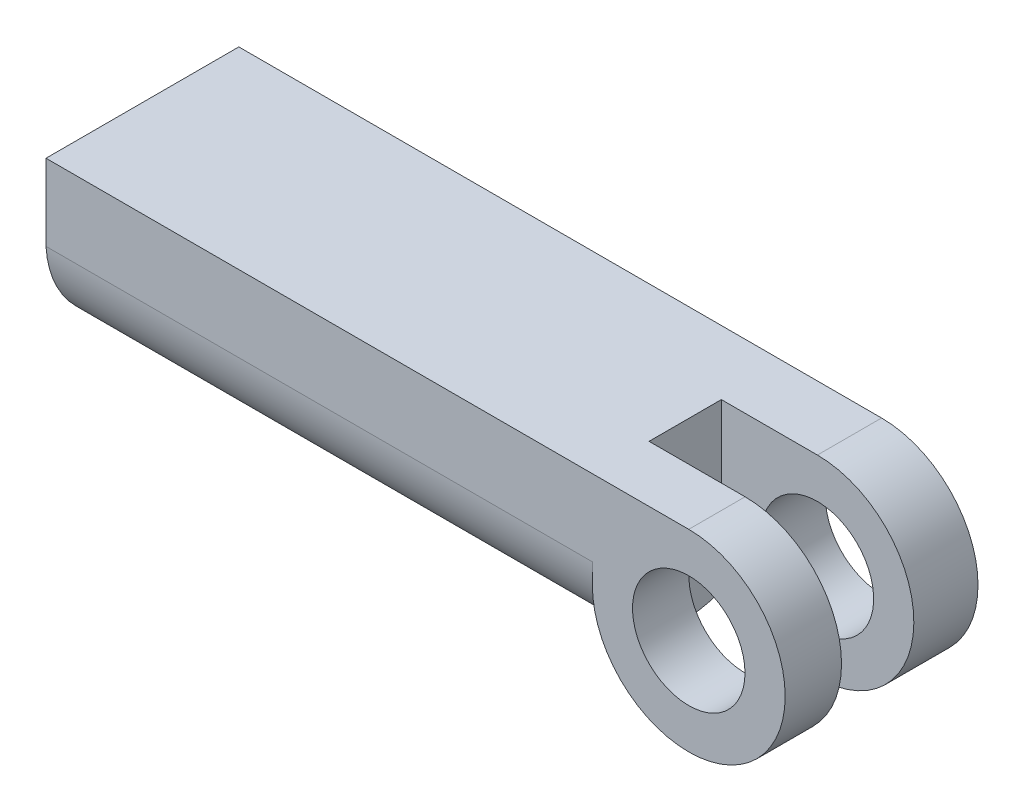
ISO-10303-21;
HEADER;
FILE_DESCRIPTION(('STEP AP214'),'2;1');
FILE_NAME('part.step','',(''),(''),'','','');
FILE_SCHEMA(('AUTOMOTIVE_DESIGN { 1 0 10303 214 1 1 1 1 }'));
ENDSEC;
DATA;
#1=APPLICATION_CONTEXT('core data for automotive mechanical design processes');
#2=APPLICATION_PROTOCOL_DEFINITION('international standard','automotive_design',2000,#1);
#3=PRODUCT_CONTEXT('',#1,'mechanical');
#4=PRODUCT('Part','Part','',(#3));
#5=PRODUCT_RELATED_PRODUCT_CATEGORY('part','',(#4));
#6=PRODUCT_DEFINITION_FORMATION('','',#4);
#7=PRODUCT_DEFINITION_CONTEXT('part definition',#1,'design');
#8=PRODUCT_DEFINITION('design','',#6,#7);
#9=PRODUCT_DEFINITION_SHAPE('','',#8);
#10=(LENGTH_UNIT() NAMED_UNIT(*) SI_UNIT(.MILLI.,.METRE.));
#11=(NAMED_UNIT(*) PLANE_ANGLE_UNIT() SI_UNIT($,.RADIAN.));
#12=(NAMED_UNIT(*) SI_UNIT($,.STERADIAN.) SOLID_ANGLE_UNIT());
#13=UNCERTAINTY_MEASURE_WITH_UNIT(LENGTH_MEASURE(1.E-05),#10,'distance_accuracy_value','');
#14=(GEOMETRIC_REPRESENTATION_CONTEXT(3) GLOBAL_UNCERTAINTY_ASSIGNED_CONTEXT((#13)) GLOBAL_UNIT_ASSIGNED_CONTEXT((#10,
#11,#12)) REPRESENTATION_CONTEXT('',''));
#15=CARTESIAN_POINT('',(0.,0.,0.));
#16=DIRECTION('',(0.,0.,1.));
#17=DIRECTION('',(1.,0.,0.));
#18=AXIS2_PLACEMENT_3D('',#15,#16,#17);
#19=CARTESIAN_POINT('',(-50.044390832328,6.00349817259111,24.));
#20=DIRECTION('',(1.,0.,0.));
#21=DIRECTION('',(0.,0.,-1.));
#22=AXIS2_PLACEMENT_3D('',#19,#20,#21);
#23=PLANE('',#22);
#24=CARTESIAN_POINT('',(-50.044390832328,17.2181076510151,12.));
#25=DIRECTION('',(-1.,0.,0.));
#26=DIRECTION('',(0.,0.,1.));
#27=AXIS2_PLACEMENT_3D('',#24,#25,#26);
#28=CIRCLE('',#27,9.00000000000001);
#29=CARTESIAN_POINT('',(-50.044390832328,17.2181076510151,21.));
#30=VERTEX_POINT('',#29);
#31=EDGE_CURVE('E214',#30,#30,#28,.T.);
#32=ORIENTED_EDGE('',*,*,#31,.F.);
#33=EDGE_LOOP('',(#32));
#34=FACE_BOUND('',#33,.T.);
#35=CARTESIAN_POINT('',(-50.044390832328,18.7534981905912,11.2499999819999));
#36=DIRECTION('',(-1.,0.,0.));
#37=DIRECTION('',(0.,0.,-1.));
#38=AXIS2_PLACEMENT_3D('',#35,#36,#37);
#39=CIRCLE('',#38,12.7720397934708);
#40=CARTESIAN_POINT('',(-50.044390832328,6.00349817259111,12.));
#41=VERTEX_POINT('',#40);
#42=CARTESIAN_POINT('',(-50.044390832328,18.0034981725912,24.));
#43=VERTEX_POINT('',#42);
#44=EDGE_CURVE('E202',#41,#43,#39,.T.);
#45=ORIENTED_EDGE('',*,*,#44,.T.);
#46=DIRECTION('',(0.,-1.,0.));
#47=VECTOR('',#46,1.);
#48=CARTESIAN_POINT('',(-50.044390832328,6.00349817259111,24.));
#49=LINE('',#48,#47);
#50=CARTESIAN_POINT('',(-50.044390832328,27.5034982085911,24.));
#51=VERTEX_POINT('',#50);
#52=EDGE_CURVE('E93',#51,#43,#49,.T.);
#53=ORIENTED_EDGE('',*,*,#52,.F.);
#54=DIRECTION('',(0.,0.,-1.));
#55=VECTOR('',#54,1.);
#56=CARTESIAN_POINT('',(-50.044390832328,27.5034982085911,24.));
#57=LINE('',#56,#55);
#58=CARTESIAN_POINT('',(-50.044390832328,27.5034982085911,0.));
#59=VERTEX_POINT('',#58);
#60=EDGE_CURVE('E85',#51,#59,#57,.T.);
#61=ORIENTED_EDGE('',*,*,#60,.T.);
#62=DIRECTION('',(0.,-1.,0.));
#63=VECTOR('',#62,1.);
#64=CARTESIAN_POINT('',(-50.044390832328,6.00349817259111,0.));
#65=LINE('',#64,#63);
#66=CARTESIAN_POINT('',(-50.044390832328,18.0034981725911,0.));
#67=VERTEX_POINT('',#66);
#68=EDGE_CURVE('E101',#59,#67,#65,.T.);
#69=ORIENTED_EDGE('',*,*,#68,.T.);
#70=CARTESIAN_POINT('',(-50.044390832328,18.7534981905911,12.750000018));
#71=DIRECTION('',(-1.,0.,0.));
#72=DIRECTION('',(0.,0.,1.));
#73=AXIS2_PLACEMENT_3D('',#70,#71,#72);
#74=CIRCLE('',#73,12.7720397934707);
#75=EDGE_CURVE('E205',#67,#41,#74,.T.);
#76=ORIENTED_EDGE('',*,*,#75,.T.);
#77=EDGE_LOOP('',(#45,#53,#61,#69,#76));
#78=FACE_BOUND('',#77,.T.);
#79=ADVANCED_FACE('F42',(#34,#78),#23,.F.);
#80=CARTESIAN_POINT('',(17.955609167672,6.13618291623271,24.));
#81=DIRECTION('',(-0.00230755398923503,0.999997337593749,0.));
#82=DIRECTION('',(-0.999997337593749,-0.00230755398923503,0.));
#83=AXIS2_PLACEMENT_3D('',#80,#81,#82);
#84=PLANE('',#83);
#85=CARTESIAN_POINT('',(5485.77206798089,18.7534981905912,11.2499999819999));
#86=DIRECTION('',(-0.00230755398923503,0.999997337593749,0.));
#87=DIRECTION('',(-0.999997337593749,-0.00230755398923503,0.));
#88=AXIS2_PLACEMENT_3D('',#85,#86,#87);
#89=ELLIPSE('',#88,5534.88232693737,12.7720397934708);
#90=CARTESIAN_POINT('',(-39.5443947303016,6.00349819959629,11.999999770456));
#91=VERTEX_POINT('',#90);
#92=CARTESIAN_POINT('',(17.955609167672,6.13618291623271,13.2320079924384));
#93=VERTEX_POINT('',#92);
#94=EDGE_CURVE('E402',#91,#93,#89,.T.);
#95=ORIENTED_EDGE('',*,*,#94,.F.);
#96=CARTESIAN_POINT('',(5485.77206798087,18.7534981905911,12.750000018));
#97=DIRECTION('',(-0.00230755398923503,0.999997337593749,0.));
#98=DIRECTION('',(-0.999997337593749,-0.00230755398923503,0.));
#99=AXIS2_PLACEMENT_3D('',#96,#97,#98);
#100=ELLIPSE('',#99,5534.88232693735,12.7720397934707);
#101=CARTESIAN_POINT('',(17.955609167672,6.13618291623271,10.7679920075615));
#102=VERTEX_POINT('',#101);
#103=EDGE_CURVE('E190',#102,#91,#100,.T.);
#104=ORIENTED_EDGE('',*,*,#103,.F.);
#105=DIRECTION('',(0.,0.,-1.));
#106=VECTOR('',#105,1.);
#107=CARTESIAN_POINT('',(17.955609167672,6.13618291623271,24.));
#108=LINE('',#107,#106);
#109=EDGE_CURVE('E12',#93,#102,#108,.T.);
#110=ORIENTED_EDGE('',*,*,#109,.F.);
#111=EDGE_LOOP('',(#95,#104,#110));
#112=FACE_BOUND('',#111,.T.);
#113=ADVANCED_FACE('F230',(#112),#84,.F.);
#114=CARTESIAN_POINT('',(17.955609167672,15.5034982085911,24.));
#115=DIRECTION('',(-1.,0.,0.));
#116=DIRECTION('',(0.,0.,1.));
#117=AXIS2_PLACEMENT_3D('',#114,#115,#116);
#118=PLANE('',#117);
#119=CARTESIAN_POINT('',(17.955609167672,18.7534981905912,11.2499999819999));
#120=DIRECTION('',(-1.,0.,0.));
#121=DIRECTION('',(0.,0.,-1.));
#122=AXIS2_PLACEMENT_3D('',#119,#120,#121);
#123=CIRCLE('',#122,12.7720397934708);
#124=CARTESIAN_POINT('',(17.955609167672,15.5034982085911,23.6016193334454));
#125=VERTEX_POINT('',#124);
#126=EDGE_CURVE('E198',#93,#125,#123,.T.);
#127=ORIENTED_EDGE('',*,*,#126,.F.);
#128=ORIENTED_EDGE('',*,*,#109,.T.);
#129=CARTESIAN_POINT('',(17.955609167672,18.7534981905911,12.750000018));
#130=DIRECTION('',(-1.,0.,0.));
#131=DIRECTION('',(0.,0.,1.));
#132=AXIS2_PLACEMENT_3D('',#129,#130,#131);
#133=CIRCLE('',#132,12.7720397934707);
#134=CARTESIAN_POINT('',(17.955609167672,15.5034982085911,0.398380666554629));
#135=VERTEX_POINT('',#134);
#136=EDGE_CURVE('E204',#135,#102,#133,.T.);
#137=ORIENTED_EDGE('',*,*,#136,.F.);
#138=DIRECTION('',(0.,0.,-1.));
#139=VECTOR('',#138,1.);
#140=CARTESIAN_POINT('',(17.955609167672,15.5034982085911,24.));
#141=LINE('',#140,#139);
#142=EDGE_CURVE('E122',#125,#135,#141,.T.);
#143=ORIENTED_EDGE('',*,*,#142,.F.);
#144=EDGE_LOOP('',(#127,#128,#137,#143));
#145=FACE_BOUND('',#144,.T.);
#146=ADVANCED_FACE('F235',(#145),#118,.F.);
#147=CARTESIAN_POINT('',(29.955609167672,15.5034982085911,24.));
#148=DIRECTION('',(0.,0.,-1.));
#149=DIRECTION('',(-1.,0.,0.));
#150=AXIS2_PLACEMENT_3D('',#147,#148,#149);
#151=CYLINDRICAL_SURFACE('',#150,7.00000696010148);
#152=CARTESIAN_POINT('',(29.955609167672,15.5034982085911,7.98625516887186));
#153=DIRECTION('',(0.,0.,-1.));
#154=DIRECTION('',(-1.,0.,0.));
#155=AXIS2_PLACEMENT_3D('',#152,#153,#154);
#156=CIRCLE('',#155,7.00000696010148);
#157=CARTESIAN_POINT('',(22.9556022075706,15.5034982085911,7.98625516887186));
#158=VERTEX_POINT('',#157);
#159=EDGE_CURVE('E45',#158,#158,#156,.T.);
#160=ORIENTED_EDGE('',*,*,#159,.F.);
#161=EDGE_LOOP('',(#160));
#162=FACE_BOUND('',#161,.T.);
#163=CARTESIAN_POINT('',(29.955609167672,15.5034982085911,0.));
#164=DIRECTION('',(0.,0.,1.));
#165=DIRECTION('',(1.,0.,0.));
#166=AXIS2_PLACEMENT_3D('',#163,#164,#165);
#167=CIRCLE('',#166,7.00000696010148);
#168=CARTESIAN_POINT('',(36.9556161277735,15.5034982085911,0.));
#169=VERTEX_POINT('',#168);
#170=EDGE_CURVE('E114',#169,#169,#167,.T.);
#171=ORIENTED_EDGE('',*,*,#170,.F.);
#172=EDGE_LOOP('',(#171));
#173=FACE_BOUND('',#172,.T.);
#174=ADVANCED_FACE('F241',(#162,#173),#151,.F.);
#175=CARTESIAN_POINT('',(29.955609167672,15.5034982085911,24.));
#176=DIRECTION('',(0.,0.,-1.));
#177=DIRECTION('',(-1.,0.,0.));
#178=AXIS2_PLACEMENT_3D('',#175,#176,#177);
#179=PLANE('',#178);
#180=DIRECTION('',(-1.,0.,0.));
#181=VECTOR('',#180,1.);
#182=CARTESIAN_POINT('',(-50.044390832328,27.5034982085911,24.));
#183=LINE('',#182,#181);
#184=CARTESIAN_POINT('',(29.955609167672,27.5034982085911,24.));
#185=VERTEX_POINT('',#184);
#186=EDGE_CURVE('E67',#185,#51,#183,.T.);
#187=ORIENTED_EDGE('',*,*,#186,.T.);
#188=ORIENTED_EDGE('',*,*,#52,.T.);
#189=DIRECTION('',(-1.,0.,0.));
#190=VECTOR('',#189,1.);
#191=CARTESIAN_POINT('',(17.955609167672,18.0034981725912,24.));
#192=LINE('',#191,#190);
#193=CARTESIAN_POINT('',(17.955609167672,18.0034981725912,24.));
#194=VERTEX_POINT('',#193);
#195=EDGE_CURVE('E398',#194,#43,#192,.T.);
#196=ORIENTED_EDGE('',*,*,#195,.F.);
#197=DIRECTION('',(0.,1.,0.));
#198=VECTOR('',#197,1.);
#199=CARTESIAN_POINT('',(17.955609167672,15.5034982085911,24.));
#200=LINE('',#199,#198);
#201=CARTESIAN_POINT('',(17.955609167672,15.5034982085911,24.));
#202=VERTEX_POINT('',#201);
#203=EDGE_CURVE('E161',#202,#194,#200,.T.);
#204=ORIENTED_EDGE('',*,*,#203,.F.);
#205=CARTESIAN_POINT('',(29.955609167672,15.5034982085911,24.));
#206=DIRECTION('',(0.,0.,1.));
#207=DIRECTION('',(-1.,0.,0.));
#208=AXIS2_PLACEMENT_3D('',#205,#206,#207);
#209=CIRCLE('',#208,12.);
#210=EDGE_CURVE('E152',#202,#185,#209,.T.);
#211=ORIENTED_EDGE('',*,*,#210,.T.);
#212=EDGE_LOOP('',(#187,#188,#196,#204,#211));
#213=FACE_BOUND('',#212,.T.);
#214=CARTESIAN_POINT('',(29.955609167672,15.5034982085911,24.));
#215=DIRECTION('',(0.,0.,1.));
#216=DIRECTION('',(1.,0.,0.));
#217=AXIS2_PLACEMENT_3D('',#214,#215,#216);
#218=CIRCLE('',#217,7.00000696010148);
#219=CARTESIAN_POINT('',(36.9556161277735,15.5034982085911,24.));
#220=VERTEX_POINT('',#219);
#221=EDGE_CURVE('E110',#220,#220,#218,.T.);
#222=ORIENTED_EDGE('',*,*,#221,.F.);
#223=EDGE_LOOP('',(#222));
#224=FACE_BOUND('',#223,.T.);
#225=ADVANCED_FACE('F156',(#213,#224),#179,.F.);
#226=CARTESIAN_POINT('',(29.955609167672,15.5034982085911,0.));
#227=DIRECTION('',(0.,0.,-1.));
#228=DIRECTION('',(-1.,0.,0.));
#229=AXIS2_PLACEMENT_3D('',#226,#227,#228);
#230=PLANE('',#229);
#231=ORIENTED_EDGE('',*,*,#68,.F.);
#232=DIRECTION('',(-1.,0.,0.));
#233=VECTOR('',#232,1.);
#234=CARTESIAN_POINT('',(-50.044390832328,27.5034982085911,0.));
#235=LINE('',#234,#233);
#236=CARTESIAN_POINT('',(29.955609167672,27.5034982085911,0.));
#237=VERTEX_POINT('',#236);
#238=EDGE_CURVE('E82',#237,#59,#235,.T.);
#239=ORIENTED_EDGE('',*,*,#238,.F.);
#240=CARTESIAN_POINT('',(29.955609167672,15.5034982085911,0.));
#241=DIRECTION('',(0.,0.,1.));
#242=DIRECTION('',(-1.,0.,0.));
#243=AXIS2_PLACEMENT_3D('',#240,#241,#242);
#244=CIRCLE('',#243,12.);
#245=CARTESIAN_POINT('',(17.955609167672,15.5034982085911,0.));
#246=VERTEX_POINT('',#245);
#247=EDGE_CURVE('E94',#246,#237,#244,.T.);
#248=ORIENTED_EDGE('',*,*,#247,.F.);
#249=DIRECTION('',(0.,1.,0.));
#250=VECTOR('',#249,1.);
#251=CARTESIAN_POINT('',(17.955609167672,15.5034982085911,0.));
#252=LINE('',#251,#250);
#253=CARTESIAN_POINT('',(17.955609167672,18.0034981725911,0.));
#254=VERTEX_POINT('',#253);
#255=EDGE_CURVE('E184',#246,#254,#252,.T.);
#256=ORIENTED_EDGE('',*,*,#255,.T.);
#257=DIRECTION('',(-1.,0.,0.));
#258=VECTOR('',#257,1.);
#259=CARTESIAN_POINT('',(17.955609167672,18.0034981725911,0.));
#260=LINE('',#259,#258);
#261=EDGE_CURVE('E109',#254,#67,#260,.T.);
#262=ORIENTED_EDGE('',*,*,#261,.T.);
#263=EDGE_LOOP('',(#231,#239,#248,#256,#262));
#264=FACE_BOUND('',#263,.T.);
#265=ORIENTED_EDGE('',*,*,#170,.T.);
#266=EDGE_LOOP('',(#265));
#267=FACE_BOUND('',#266,.T.);
#268=ADVANCED_FACE('F105',(#264,#267),#230,.T.);
#269=CARTESIAN_POINT('',(29.955609167672,15.5034982085911,24.));
#270=DIRECTION('',(0.,0.,-1.));
#271=DIRECTION('',(-1.,0.,0.));
#272=AXIS2_PLACEMENT_3D('',#269,#270,#271);
#273=CYLINDRICAL_SURFACE('',#272,12.);
#274=CARTESIAN_POINT('',(29.955609167672,15.5034982085911,16.9862551688719));
#275=DIRECTION('',(0.,0.,1.));
#276=DIRECTION('',(1.,0.,0.));
#277=AXIS2_PLACEMENT_3D('',#274,#275,#276);
#278=CIRCLE('',#277,12.);
#279=CARTESIAN_POINT('',(18.,14.4722807582552,16.9862551688719));
#280=VERTEX_POINT('',#279);
#281=CARTESIAN_POINT('',(29.955609167672,27.5034982085911,16.9862551688719));
#282=VERTEX_POINT('',#281);
#283=EDGE_CURVE('E126',#280,#282,#278,.T.);
#284=ORIENTED_EDGE('',*,*,#283,.T.);
#285=DIRECTION('',(0.,0.,-1.));
#286=VECTOR('',#285,1.);
#287=CARTESIAN_POINT('',(29.955609167672,27.5034982085911,24.));
#288=LINE('',#287,#286);
#289=EDGE_CURVE('E119',#185,#282,#288,.T.);
#290=ORIENTED_EDGE('',*,*,#289,.F.);
#291=ORIENTED_EDGE('',*,*,#210,.F.);
#292=EDGE_CURVE('E50',#202,#125,#141,.T.);
#293=ORIENTED_EDGE('',*,*,#292,.T.);
#294=ORIENTED_EDGE('',*,*,#142,.T.);
#295=DIRECTION('',(0.,0.,-1.));
#296=VECTOR('',#295,1.);
#297=CARTESIAN_POINT('',(17.955609167672,15.5034982085911,24.));
#298=LINE('',#297,#296);
#299=EDGE_CURVE('E182',#135,#246,#298,.T.);
#300=ORIENTED_EDGE('',*,*,#299,.T.);
#301=ORIENTED_EDGE('',*,*,#247,.T.);
#302=CARTESIAN_POINT('',(29.955609167672,27.5034982085911,7.98625516887186));
#303=VERTEX_POINT('',#302);
#304=EDGE_CURVE('E88',#303,#237,#288,.T.);
#305=ORIENTED_EDGE('',*,*,#304,.F.);
#306=CARTESIAN_POINT('',(29.955609167672,15.5034982085911,7.98625516887186));
#307=DIRECTION('',(0.,0.,-1.));
#308=DIRECTION('',(-1.,0.,0.));
#309=AXIS2_PLACEMENT_3D('',#306,#307,#308);
#310=CIRCLE('',#309,12.);
#311=CARTESIAN_POINT('',(18.,14.4722807582552,7.98625516887186));
#312=VERTEX_POINT('',#311);
#313=EDGE_CURVE('E144',#303,#312,#310,.T.);
#314=ORIENTED_EDGE('',*,*,#313,.T.);
#315=DIRECTION('',(0.,0.,-1.));
#316=VECTOR('',#315,1.);
#317=CARTESIAN_POINT('',(18.,14.4722807582552,24.));
#318=LINE('',#317,#316);
#319=EDGE_CURVE('E147',#312,#280,#318,.F.);
#320=ORIENTED_EDGE('',*,*,#319,.T.);
#321=EDGE_LOOP('',(#284,#290,#291,#293,#294,#300,#301,#305,#314,#320));
#322=FACE_BOUND('',#321,.T.);
#323=ADVANCED_FACE('F163',(#322),#273,.T.);
#324=CARTESIAN_POINT('',(-50.044390832328,27.5034982085911,24.));
#325=DIRECTION('',(0.,-1.,0.));
#326=DIRECTION('',(0.,0.,-1.));
#327=AXIS2_PLACEMENT_3D('',#324,#325,#326);
#328=PLANE('',#327);
#329=ORIENTED_EDGE('',*,*,#60,.F.);
#330=ORIENTED_EDGE('',*,*,#186,.F.);
#331=ORIENTED_EDGE('',*,*,#289,.T.);
#332=DIRECTION('',(1.,0.,0.));
#333=VECTOR('',#332,1.);
#334=CARTESIAN_POINT('',(18.,27.5034982085911,16.9862551688719));
#335=LINE('',#334,#333);
#336=CARTESIAN_POINT('',(18.,27.5034982085911,16.9862551688719));
#337=VERTEX_POINT('',#336);
#338=EDGE_CURVE('E127',#337,#282,#335,.T.);
#339=ORIENTED_EDGE('',*,*,#338,.F.);
#340=DIRECTION('',(0.,0.,1.));
#341=VECTOR('',#340,1.);
#342=CARTESIAN_POINT('',(18.,27.5034982085911,16.9862551688719));
#343=LINE('',#342,#341);
#344=CARTESIAN_POINT('',(18.,27.5034982085911,7.98625516887186));
#345=VERTEX_POINT('',#344);
#346=EDGE_CURVE('E178',#345,#337,#343,.T.);
#347=ORIENTED_EDGE('',*,*,#346,.F.);
#348=DIRECTION('',(1.,0.,0.));
#349=VECTOR('',#348,1.);
#350=CARTESIAN_POINT('',(18.,27.5034982085911,7.98625516887186));
#351=LINE('',#350,#349);
#352=EDGE_CURVE('E58',#345,#303,#351,.T.);
#353=ORIENTED_EDGE('',*,*,#352,.T.);
#354=ORIENTED_EDGE('',*,*,#304,.T.);
#355=ORIENTED_EDGE('',*,*,#238,.T.);
#356=EDGE_LOOP('',(#329,#330,#331,#339,#347,#353,#354,#355));
#357=FACE_BOUND('',#356,.T.);
#358=ADVANCED_FACE('F84',(#357),#328,.F.);
#359=CARTESIAN_POINT('',(29.955609167672,15.5034982085911,16.9862551688719));
#360=DIRECTION('',(0.,0.,1.));
#361=DIRECTION('',(1.,0.,0.));
#362=AXIS2_PLACEMENT_3D('',#359,#360,#361);
#363=CIRCLE('',#362,7.00000696010148);
#364=CARTESIAN_POINT('',(36.9556161277735,15.5034982085911,16.9862551688719));
#365=VERTEX_POINT('',#364);
#366=EDGE_CURVE('E124',#365,#365,#363,.T.);
#367=ORIENTED_EDGE('',*,*,#366,.F.);
#368=EDGE_LOOP('',(#367));
#369=FACE_BOUND('',#368,.T.);
#370=ORIENTED_EDGE('',*,*,#221,.T.);
#371=EDGE_LOOP('',(#370));
#372=FACE_BOUND('',#371,.T.);
#373=ADVANCED_FACE('F250',(#369,#372),#151,.F.);
#374=CARTESIAN_POINT('',(18.,0.,0.));
#375=DIRECTION('',(-1.,0.,0.));
#376=DIRECTION('',(0.,0.,1.));
#377=AXIS2_PLACEMENT_3D('',#374,#375,#376);
#378=PLANE('',#377);
#379=DIRECTION('',(0.,1.,0.));
#380=VECTOR('',#379,1.);
#381=CARTESIAN_POINT('',(18.,3.50349820859101,7.98625516887186));
#382=LINE('',#381,#380);
#383=EDGE_CURVE('E175',#312,#345,#382,.T.);
#384=ORIENTED_EDGE('',*,*,#383,.T.);
#385=ORIENTED_EDGE('',*,*,#346,.T.);
#386=DIRECTION('',(0.,-1.,0.));
#387=VECTOR('',#386,1.);
#388=CARTESIAN_POINT('',(18.,27.5034982085911,16.9862551688719));
#389=LINE('',#388,#387);
#390=EDGE_CURVE('E139',#337,#280,#389,.T.);
#391=ORIENTED_EDGE('',*,*,#390,.T.);
#392=ORIENTED_EDGE('',*,*,#319,.F.);
#393=EDGE_LOOP('',(#384,#385,#391,#392));
#394=FACE_BOUND('',#393,.T.);
#395=ADVANCED_FACE('F257',(#394),#378,.F.);
#396=CARTESIAN_POINT('',(18.,3.50349820859101,7.98625516887186));
#397=DIRECTION('',(0.,0.,-1.));
#398=DIRECTION('',(-1.,0.,0.));
#399=AXIS2_PLACEMENT_3D('',#396,#397,#398);
#400=PLANE('',#399);
#401=ORIENTED_EDGE('',*,*,#159,.T.);
#402=EDGE_LOOP('',(#401));
#403=FACE_BOUND('',#402,.T.);
#404=ORIENTED_EDGE('',*,*,#352,.F.);
#405=ORIENTED_EDGE('',*,*,#383,.F.);
#406=ORIENTED_EDGE('',*,*,#313,.F.);
#407=EDGE_LOOP('',(#404,#405,#406));
#408=FACE_BOUND('',#407,.T.);
#409=ADVANCED_FACE('F174',(#403,#408),#400,.F.);
#410=CARTESIAN_POINT('',(18.,27.5034982085911,16.9862551688719));
#411=DIRECTION('',(0.,0.,1.));
#412=DIRECTION('',(1.,0.,0.));
#413=AXIS2_PLACEMENT_3D('',#410,#411,#412);
#414=PLANE('',#413);
#415=ORIENTED_EDGE('',*,*,#366,.T.);
#416=EDGE_LOOP('',(#415));
#417=FACE_BOUND('',#416,.T.);
#418=ORIENTED_EDGE('',*,*,#390,.F.);
#419=ORIENTED_EDGE('',*,*,#338,.T.);
#420=ORIENTED_EDGE('',*,*,#283,.F.);
#421=EDGE_LOOP('',(#418,#419,#420));
#422=FACE_BOUND('',#421,.T.);
#423=ADVANCED_FACE('F261',(#417,#422),#414,.F.);
#424=CARTESIAN_POINT('',(17.955609167672,18.7534981905912,11.2499999819999));
#425=DIRECTION('',(-1.,0.,0.));
#426=DIRECTION('',(0.,0.,1.));
#427=AXIS2_PLACEMENT_3D('',#424,#425,#426);
#428=CYLINDRICAL_SURFACE('',#427,12.7720397934708);
#429=ORIENTED_EDGE('',*,*,#195,.T.);
#430=ORIENTED_EDGE('',*,*,#44,.F.);
#431=DIRECTION('',(-1.,0.,0.));
#432=VECTOR('',#431,1.);
#433=CARTESIAN_POINT('',(17.955609167672,6.00349817259111,12.));
#434=LINE('',#433,#432);
#435=EDGE_CURVE('E192',#91,#41,#434,.T.);
#436=ORIENTED_EDGE('',*,*,#435,.F.);
#437=ORIENTED_EDGE('',*,*,#94,.T.);
#438=ORIENTED_EDGE('',*,*,#126,.T.);
#439=EDGE_CURVE('E208',#125,#194,#123,.T.);
#440=ORIENTED_EDGE('',*,*,#439,.T.);
#441=EDGE_LOOP('',(#429,#430,#436,#437,#438,#440));
#442=FACE_BOUND('',#441,.T.);
#443=ADVANCED_FACE('F264',(#442),#428,.T.);
#444=CARTESIAN_POINT('',(17.955609167672,18.7534981905911,12.750000018));
#445=DIRECTION('',(-1.,0.,0.));
#446=DIRECTION('',(0.,0.,1.));
#447=AXIS2_PLACEMENT_3D('',#444,#445,#446);
#448=CYLINDRICAL_SURFACE('',#447,12.7720397934707);
#449=EDGE_CURVE('E211',#254,#135,#133,.T.);
#450=ORIENTED_EDGE('',*,*,#449,.T.);
#451=ORIENTED_EDGE('',*,*,#136,.T.);
#452=ORIENTED_EDGE('',*,*,#103,.T.);
#453=ORIENTED_EDGE('',*,*,#435,.T.);
#454=ORIENTED_EDGE('',*,*,#75,.F.);
#455=ORIENTED_EDGE('',*,*,#261,.F.);
#456=EDGE_LOOP('',(#450,#451,#452,#453,#454,#455));
#457=FACE_BOUND('',#456,.T.);
#458=ADVANCED_FACE('F270',(#457),#448,.T.);
#459=CARTESIAN_POINT('',(17.955609167672,15.5034982085911,12.));
#460=DIRECTION('',(-1.,0.,0.));
#461=DIRECTION('',(0.,0.,1.));
#462=AXIS2_PLACEMENT_3D('',#459,#460,#461);
#463=PLANE('',#462);
#464=ORIENTED_EDGE('',*,*,#203,.T.);
#465=ORIENTED_EDGE('',*,*,#439,.F.);
#466=ORIENTED_EDGE('',*,*,#292,.F.);
#467=EDGE_LOOP('',(#464,#465,#466));
#468=FACE_BOUND('',#467,.T.);
#469=ADVANCED_FACE('F269',(#468),#463,.T.);
#470=ORIENTED_EDGE('',*,*,#299,.F.);
#471=ORIENTED_EDGE('',*,*,#449,.F.);
#472=ORIENTED_EDGE('',*,*,#255,.F.);
#473=EDGE_LOOP('',(#470,#471,#472));
#474=FACE_BOUND('',#473,.T.);
#475=ADVANCED_FACE('F225',(#474),#463,.T.);
#476=CARTESIAN_POINT('',(16.955609167672,17.2181076510151,12.));
#477=DIRECTION('',(-1.,0.,0.));
#478=DIRECTION('',(0.,0.,1.));
#479=AXIS2_PLACEMENT_3D('',#476,#477,#478);
#480=CYLINDRICAL_SURFACE('',#479,9.00000000000001);
#481=CARTESIAN_POINT('',(16.955609167672,17.2181076510151,12.));
#482=DIRECTION('',(-1.,0.,0.));
#483=DIRECTION('',(0.,0.,1.));
#484=AXIS2_PLACEMENT_3D('',#481,#482,#483);
#485=CIRCLE('',#484,9.00000000000001);
#486=CARTESIAN_POINT('',(16.955609167672,17.2181076510151,21.));
#487=VERTEX_POINT('',#486);
#488=EDGE_CURVE('E207',#487,#487,#485,.T.);
#489=ORIENTED_EDGE('',*,*,#488,.F.);
#490=EDGE_LOOP('',(#489));
#491=FACE_BOUND('',#490,.T.);
#492=ORIENTED_EDGE('',*,*,#31,.T.);
#493=EDGE_LOOP('',(#492));
#494=FACE_BOUND('',#493,.T.);
#495=ADVANCED_FACE('F222',(#491,#494),#480,.F.);
#496=CARTESIAN_POINT('',(16.955609167672,17.2181076510151,12.));
#497=DIRECTION('',(-1.,0.,0.));
#498=DIRECTION('',(0.,0.,1.));
#499=AXIS2_PLACEMENT_3D('',#496,#497,#498);
#500=PLANE('',#499);
#501=ORIENTED_EDGE('',*,*,#488,.T.);
#502=EDGE_LOOP('',(#501));
#503=FACE_BOUND('',#502,.T.);
#504=ADVANCED_FACE('F220',(#503),#500,.T.);
#505=CLOSED_SHELL('',(#79,#113,#146,#174,#225,#268,#323,#358,#373,#395,#409,#423,#443,#458,#469,
#475,#495,#504));
#506=MANIFOLD_SOLID_BREP('B2',#505);
#507=ADVANCED_BREP_SHAPE_REPRESENTATION('',(#18,#506),#14);
#508=SHAPE_DEFINITION_REPRESENTATION(#9,#507);
ENDSEC;
END-ISO-10303-21;
